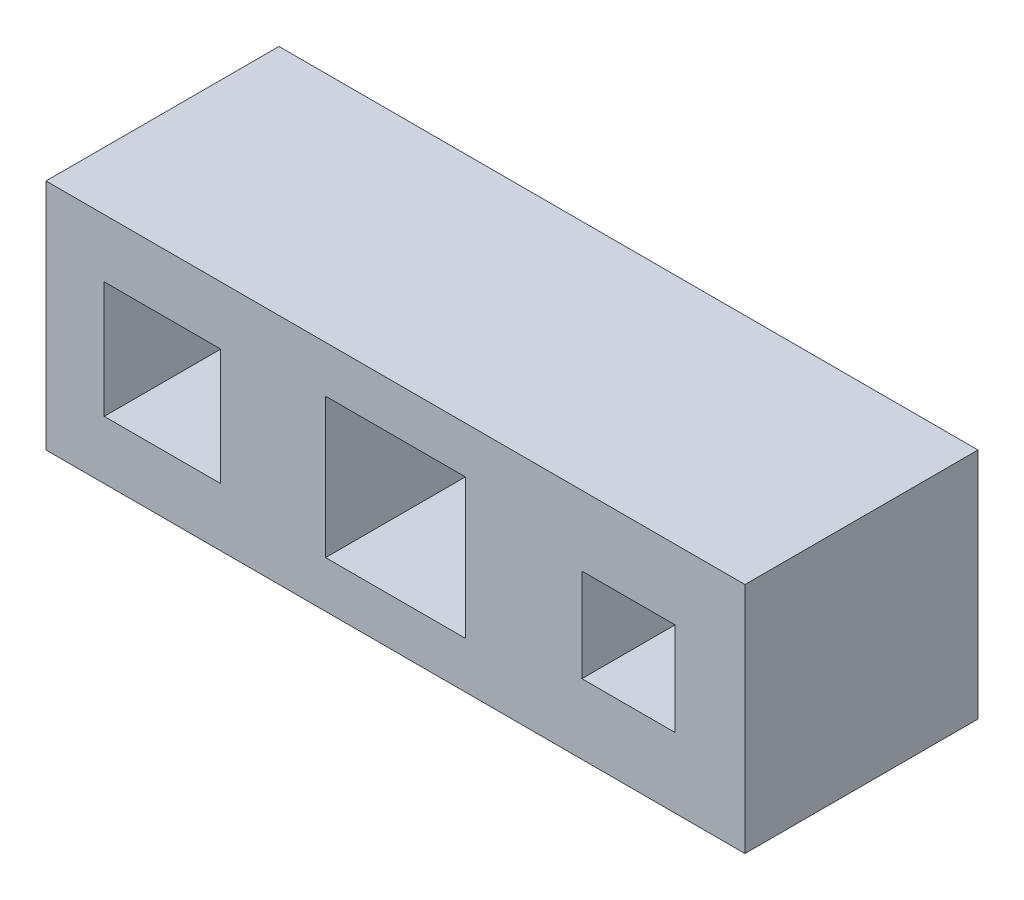
ISO-10303-21;
HEADER;
FILE_DESCRIPTION(('STEP AP214'),'2;1');
FILE_NAME('part.step','',(''),(''),'','','');
FILE_SCHEMA(('AUTOMOTIVE_DESIGN { 1 0 10303 214 1 1 1 1 }'));
ENDSEC;
DATA;
#1=APPLICATION_CONTEXT('core data for automotive mechanical design processes');
#2=APPLICATION_PROTOCOL_DEFINITION('international standard','automotive_design',2000,#1);
#3=PRODUCT_CONTEXT('',#1,'mechanical');
#4=PRODUCT('Part','Part','',(#3));
#5=PRODUCT_RELATED_PRODUCT_CATEGORY('part','',(#4));
#6=PRODUCT_DEFINITION_FORMATION('','',#4);
#7=PRODUCT_DEFINITION_CONTEXT('part definition',#1,'design');
#8=PRODUCT_DEFINITION('design','',#6,#7);
#9=PRODUCT_DEFINITION_SHAPE('','',#8);
#10=(LENGTH_UNIT() NAMED_UNIT(*) SI_UNIT(.MILLI.,.METRE.));
#11=(NAMED_UNIT(*) PLANE_ANGLE_UNIT() SI_UNIT($,.RADIAN.));
#12=(NAMED_UNIT(*) SI_UNIT($,.STERADIAN.) SOLID_ANGLE_UNIT());
#13=UNCERTAINTY_MEASURE_WITH_UNIT(LENGTH_MEASURE(1.E-05),#10,'distance_accuracy_value','');
#14=(GEOMETRIC_REPRESENTATION_CONTEXT(3) GLOBAL_UNCERTAINTY_ASSIGNED_CONTEXT((#13)) GLOBAL_UNIT_ASSIGNED_CONTEXT((#10,
#11,#12)) REPRESENTATION_CONTEXT('',''));
#15=CARTESIAN_POINT('',(0.,0.,0.));
#16=DIRECTION('',(0.,0.,1.));
#17=DIRECTION('',(1.,0.,0.));
#18=AXIS2_PLACEMENT_3D('',#15,#16,#17);
#19=CARTESIAN_POINT('',(0.,0.,5.));
#20=DIRECTION('',(0.,0.,-1.));
#21=DIRECTION('',(-1.,0.,0.));
#22=AXIS2_PLACEMENT_3D('',#19,#20,#21);
#23=PLANE('',#22);
#24=DIRECTION('',(0.,-1.,0.));
#25=VECTOR('',#24,1.);
#26=CARTESIAN_POINT('',(1.25,1.25,5.));
#27=LINE('',#26,#25);
#28=CARTESIAN_POINT('',(1.25,3.75,5.));
#29=VERTEX_POINT('',#28);
#30=CARTESIAN_POINT('',(1.25,1.25,5.));
#31=VERTEX_POINT('',#30);
#32=EDGE_CURVE('E182',#29,#31,#27,.T.);
#33=ORIENTED_EDGE('',*,*,#32,.F.);
#34=DIRECTION('',(-1.,0.,0.));
#35=VECTOR('',#34,1.);
#36=CARTESIAN_POINT('',(1.25,3.75,5.));
#37=LINE('',#36,#35);
#38=CARTESIAN_POINT('',(3.75,3.75,5.));
#39=VERTEX_POINT('',#38);
#40=EDGE_CURVE('E190',#39,#29,#37,.T.);
#41=ORIENTED_EDGE('',*,*,#40,.F.);
#42=DIRECTION('',(0.,1.,0.));
#43=VECTOR('',#42,1.);
#44=CARTESIAN_POINT('',(3.75,1.25,5.));
#45=LINE('',#44,#43);
#46=CARTESIAN_POINT('',(3.75,1.25,5.));
#47=VERTEX_POINT('',#46);
#48=EDGE_CURVE('E187',#47,#39,#45,.T.);
#49=ORIENTED_EDGE('',*,*,#48,.F.);
#50=DIRECTION('',(1.,0.,0.));
#51=VECTOR('',#50,1.);
#52=CARTESIAN_POINT('',(1.25,1.25,5.));
#53=LINE('',#52,#51);
#54=EDGE_CURVE('E184',#31,#47,#53,.T.);
#55=ORIENTED_EDGE('',*,*,#54,.F.);
#56=EDGE_LOOP('',(#33,#41,#49,#55));
#57=FACE_BOUND('',#56,.T.);
#58=DIRECTION('',(0.,-1.,0.));
#59=VECTOR('',#58,1.);
#60=CARTESIAN_POINT('',(0.,0.,5.));
#61=LINE('',#60,#59);
#62=CARTESIAN_POINT('',(0.,5.,5.));
#63=VERTEX_POINT('',#62);
#64=CARTESIAN_POINT('',(0.,0.,5.));
#65=VERTEX_POINT('',#64);
#66=EDGE_CURVE('E244',#63,#65,#61,.T.);
#67=ORIENTED_EDGE('',*,*,#66,.T.);
#68=DIRECTION('',(1.,0.,0.));
#69=VECTOR('',#68,1.);
#70=CARTESIAN_POINT('',(0.,0.,5.));
#71=LINE('',#70,#69);
#72=CARTESIAN_POINT('',(15.,0.,5.));
#73=VERTEX_POINT('',#72);
#74=EDGE_CURVE('E247',#65,#73,#71,.T.);
#75=ORIENTED_EDGE('',*,*,#74,.T.);
#76=DIRECTION('',(0.,1.,0.));
#77=VECTOR('',#76,1.);
#78=CARTESIAN_POINT('',(15.,5.,5.));
#79=LINE('',#78,#77);
#80=CARTESIAN_POINT('',(15.,5.,5.));
#81=VERTEX_POINT('',#80);
#82=EDGE_CURVE('E250',#73,#81,#79,.T.);
#83=ORIENTED_EDGE('',*,*,#82,.T.);
#84=DIRECTION('',(-1.,0.,0.));
#85=VECTOR('',#84,1.);
#86=CARTESIAN_POINT('',(5.,5.,5.));
#87=LINE('',#86,#85);
#88=EDGE_CURVE('E252',#81,#63,#87,.T.);
#89=ORIENTED_EDGE('',*,*,#88,.T.);
#90=EDGE_LOOP('',(#67,#75,#83,#89));
#91=FACE_BOUND('',#90,.T.);
#92=DIRECTION('',(0.,1.,0.));
#93=VECTOR('',#92,1.);
#94=CARTESIAN_POINT('',(13.5,3.5,5.));
#95=LINE('',#94,#93);
#96=CARTESIAN_POINT('',(13.5,1.5,5.));
#97=VERTEX_POINT('',#96);
#98=CARTESIAN_POINT('',(13.5,3.5,5.));
#99=VERTEX_POINT('',#98);
#100=EDGE_CURVE('E213',#97,#99,#95,.T.);
#101=ORIENTED_EDGE('',*,*,#100,.F.);
#102=DIRECTION('',(1.,0.,0.));
#103=VECTOR('',#102,1.);
#104=CARTESIAN_POINT('',(13.5,1.5,5.));
#105=LINE('',#104,#103);
#106=CARTESIAN_POINT('',(11.5,1.5,5.));
#107=VERTEX_POINT('',#106);
#108=EDGE_CURVE('E221',#107,#97,#105,.T.);
#109=ORIENTED_EDGE('',*,*,#108,.F.);
#110=DIRECTION('',(0.,-1.,0.));
#111=VECTOR('',#110,1.);
#112=CARTESIAN_POINT('',(11.5,3.5,5.));
#113=LINE('',#112,#111);
#114=CARTESIAN_POINT('',(11.5,3.5,5.));
#115=VERTEX_POINT('',#114);
#116=EDGE_CURVE('E218',#115,#107,#113,.T.);
#117=ORIENTED_EDGE('',*,*,#116,.F.);
#118=DIRECTION('',(-1.,0.,0.));
#119=VECTOR('',#118,1.);
#120=CARTESIAN_POINT('',(13.5,3.5,5.));
#121=LINE('',#120,#119);
#122=EDGE_CURVE('E215',#99,#115,#121,.T.);
#123=ORIENTED_EDGE('',*,*,#122,.F.);
#124=EDGE_LOOP('',(#101,#109,#117,#123));
#125=FACE_BOUND('',#124,.T.);
#126=DIRECTION('',(0.,1.,0.));
#127=VECTOR('',#126,1.);
#128=CARTESIAN_POINT('',(9.,4.,5.));
#129=LINE('',#128,#127);
#130=CARTESIAN_POINT('',(9.,0.999999999999998,5.));
#131=VERTEX_POINT('',#130);
#132=CARTESIAN_POINT('',(9.,4.,5.));
#133=VERTEX_POINT('',#132);
#134=EDGE_CURVE('E146',#131,#133,#129,.T.);
#135=ORIENTED_EDGE('',*,*,#134,.F.);
#136=DIRECTION('',(1.,0.,0.));
#137=VECTOR('',#136,1.);
#138=CARTESIAN_POINT('',(9.,0.999999999999998,5.));
#139=LINE('',#138,#137);
#140=CARTESIAN_POINT('',(6.,0.999999999999998,5.));
#141=VERTEX_POINT('',#140);
#142=EDGE_CURVE('E168',#141,#131,#139,.T.);
#143=ORIENTED_EDGE('',*,*,#142,.F.);
#144=DIRECTION('',(0.,-1.,0.));
#145=VECTOR('',#144,1.);
#146=CARTESIAN_POINT('',(6.,4.,5.));
#147=LINE('',#146,#145);
#148=CARTESIAN_POINT('',(6.,4.,5.));
#149=VERTEX_POINT('',#148);
#150=EDGE_CURVE('E166',#149,#141,#147,.T.);
#151=ORIENTED_EDGE('',*,*,#150,.F.);
#152=DIRECTION('',(-1.,0.,0.));
#153=VECTOR('',#152,1.);
#154=CARTESIAN_POINT('',(9.,4.,5.));
#155=LINE('',#154,#153);
#156=EDGE_CURVE('E154',#133,#149,#155,.T.);
#157=ORIENTED_EDGE('',*,*,#156,.F.);
#158=EDGE_LOOP('',(#135,#143,#151,#157));
#159=FACE_BOUND('',#158,.T.);
#160=ADVANCED_FACE('F33',(#57,#91,#125,#159),#23,.F.);
#161=CARTESIAN_POINT('',(0.,0.,0.));
#162=DIRECTION('',(0.,0.,-1.));
#163=DIRECTION('',(-1.,0.,0.));
#164=AXIS2_PLACEMENT_3D('',#161,#162,#163);
#165=PLANE('',#164);
#166=DIRECTION('',(0.,-1.,0.));
#167=VECTOR('',#166,1.);
#168=CARTESIAN_POINT('',(0.,0.,0.));
#169=LINE('',#168,#167);
#170=CARTESIAN_POINT('',(0.,5.,0.));
#171=VERTEX_POINT('',#170);
#172=CARTESIAN_POINT('',(0.,0.,0.));
#173=VERTEX_POINT('',#172);
#174=EDGE_CURVE('E243',#171,#173,#169,.T.);
#175=ORIENTED_EDGE('',*,*,#174,.F.);
#176=DIRECTION('',(-1.,0.,0.));
#177=VECTOR('',#176,1.);
#178=CARTESIAN_POINT('',(0.,5.,0.));
#179=LINE('',#178,#177);
#180=CARTESIAN_POINT('',(15.,5.,0.));
#181=VERTEX_POINT('',#180);
#182=EDGE_CURVE('E248',#181,#171,#179,.T.);
#183=ORIENTED_EDGE('',*,*,#182,.F.);
#184=DIRECTION('',(0.,1.,0.));
#185=VECTOR('',#184,1.);
#186=CARTESIAN_POINT('',(15.,5.,0.));
#187=LINE('',#186,#185);
#188=CARTESIAN_POINT('',(15.,0.,0.));
#189=VERTEX_POINT('',#188);
#190=EDGE_CURVE('E259',#189,#181,#187,.T.);
#191=ORIENTED_EDGE('',*,*,#190,.F.);
#192=DIRECTION('',(1.,0.,0.));
#193=VECTOR('',#192,1.);
#194=CARTESIAN_POINT('',(5.,0.,0.));
#195=LINE('',#194,#193);
#196=EDGE_CURVE('E257',#173,#189,#195,.T.);
#197=ORIENTED_EDGE('',*,*,#196,.F.);
#198=EDGE_LOOP('',(#175,#183,#191,#197));
#199=FACE_BOUND('',#198,.T.);
#200=DIRECTION('',(1.,0.,0.));
#201=VECTOR('',#200,1.);
#202=CARTESIAN_POINT('',(13.5,1.5,0.));
#203=LINE('',#202,#201);
#204=CARTESIAN_POINT('',(11.5,1.5,0.));
#205=VERTEX_POINT('',#204);
#206=CARTESIAN_POINT('',(13.5,1.5,0.));
#207=VERTEX_POINT('',#206);
#208=EDGE_CURVE('E216',#205,#207,#203,.T.);
#209=ORIENTED_EDGE('',*,*,#208,.T.);
#210=DIRECTION('',(0.,1.,0.));
#211=VECTOR('',#210,1.);
#212=CARTESIAN_POINT('',(13.5,3.5,0.));
#213=LINE('',#212,#211);
#214=CARTESIAN_POINT('',(13.5,3.5,0.));
#215=VERTEX_POINT('',#214);
#216=EDGE_CURVE('E212',#207,#215,#213,.T.);
#217=ORIENTED_EDGE('',*,*,#216,.T.);
#218=DIRECTION('',(-1.,0.,0.));
#219=VECTOR('',#218,1.);
#220=CARTESIAN_POINT('',(13.5,3.5,0.));
#221=LINE('',#220,#219);
#222=CARTESIAN_POINT('',(11.5,3.5,0.));
#223=VERTEX_POINT('',#222);
#224=EDGE_CURVE('E226',#215,#223,#221,.T.);
#225=ORIENTED_EDGE('',*,*,#224,.T.);
#226=DIRECTION('',(0.,-1.,0.));
#227=VECTOR('',#226,1.);
#228=CARTESIAN_POINT('',(11.5,3.5,0.));
#229=LINE('',#228,#227);
#230=EDGE_CURVE('E229',#223,#205,#229,.T.);
#231=ORIENTED_EDGE('',*,*,#230,.T.);
#232=EDGE_LOOP('',(#209,#217,#225,#231));
#233=FACE_BOUND('',#232,.T.);
#234=DIRECTION('',(-1.,0.,0.));
#235=VECTOR('',#234,1.);
#236=CARTESIAN_POINT('',(1.25,3.75,0.));
#237=LINE('',#236,#235);
#238=CARTESIAN_POINT('',(3.75,3.75,0.));
#239=VERTEX_POINT('',#238);
#240=CARTESIAN_POINT('',(1.25,3.75,0.));
#241=VERTEX_POINT('',#240);
#242=EDGE_CURVE('E185',#239,#241,#237,.T.);
#243=ORIENTED_EDGE('',*,*,#242,.T.);
#244=DIRECTION('',(0.,-1.,0.));
#245=VECTOR('',#244,1.);
#246=CARTESIAN_POINT('',(1.25,1.25,0.));
#247=LINE('',#246,#245);
#248=CARTESIAN_POINT('',(1.25,1.25,0.));
#249=VERTEX_POINT('',#248);
#250=EDGE_CURVE('E162',#241,#249,#247,.T.);
#251=ORIENTED_EDGE('',*,*,#250,.T.);
#252=DIRECTION('',(1.,0.,0.));
#253=VECTOR('',#252,1.);
#254=CARTESIAN_POINT('',(1.25,1.25,0.));
#255=LINE('',#254,#253);
#256=CARTESIAN_POINT('',(3.75,1.25,0.));
#257=VERTEX_POINT('',#256);
#258=EDGE_CURVE('E195',#249,#257,#255,.T.);
#259=ORIENTED_EDGE('',*,*,#258,.T.);
#260=DIRECTION('',(0.,1.,0.));
#261=VECTOR('',#260,1.);
#262=CARTESIAN_POINT('',(3.75,1.25,0.));
#263=LINE('',#262,#261);
#264=EDGE_CURVE('E198',#257,#239,#263,.T.);
#265=ORIENTED_EDGE('',*,*,#264,.T.);
#266=EDGE_LOOP('',(#243,#251,#259,#265));
#267=FACE_BOUND('',#266,.T.);
#268=DIRECTION('',(1.,0.,0.));
#269=VECTOR('',#268,1.);
#270=CARTESIAN_POINT('',(9.,0.999999999999998,0.));
#271=LINE('',#270,#269);
#272=CARTESIAN_POINT('',(6.,0.999999999999998,0.));
#273=VERTEX_POINT('',#272);
#274=CARTESIAN_POINT('',(9.,0.999999999999998,0.));
#275=VERTEX_POINT('',#274);
#276=EDGE_CURVE('E155',#273,#275,#271,.T.);
#277=ORIENTED_EDGE('',*,*,#276,.T.);
#278=DIRECTION('',(0.,1.,0.));
#279=VECTOR('',#278,1.);
#280=CARTESIAN_POINT('',(9.,4.,0.));
#281=LINE('',#280,#279);
#282=CARTESIAN_POINT('',(9.,4.,0.));
#283=VERTEX_POINT('',#282);
#284=EDGE_CURVE('E56',#275,#283,#281,.T.);
#285=ORIENTED_EDGE('',*,*,#284,.T.);
#286=DIRECTION('',(-1.,0.,0.));
#287=VECTOR('',#286,1.);
#288=CARTESIAN_POINT('',(9.,4.,0.));
#289=LINE('',#288,#287);
#290=CARTESIAN_POINT('',(6.,4.,0.));
#291=VERTEX_POINT('',#290);
#292=EDGE_CURVE('E161',#283,#291,#289,.T.);
#293=ORIENTED_EDGE('',*,*,#292,.T.);
#294=DIRECTION('',(0.,-1.,0.));
#295=VECTOR('',#294,1.);
#296=CARTESIAN_POINT('',(6.,4.,0.));
#297=LINE('',#296,#295);
#298=EDGE_CURVE('E174',#291,#273,#297,.T.);
#299=ORIENTED_EDGE('',*,*,#298,.T.);
#300=EDGE_LOOP('',(#277,#285,#293,#299));
#301=FACE_BOUND('',#300,.T.);
#302=ADVANCED_FACE('F277',(#199,#233,#267,#301),#165,.T.);
#303=CARTESIAN_POINT('',(0.,0.,5.));
#304=DIRECTION('',(1.,0.,0.));
#305=DIRECTION('',(0.,0.,-1.));
#306=AXIS2_PLACEMENT_3D('',#303,#304,#305);
#307=PLANE('',#306);
#308=ORIENTED_EDGE('',*,*,#174,.T.);
#309=DIRECTION('',(0.,0.,-1.));
#310=VECTOR('',#309,1.);
#311=CARTESIAN_POINT('',(0.,0.,5.));
#312=LINE('',#311,#310);
#313=EDGE_CURVE('E11',#65,#173,#312,.T.);
#314=ORIENTED_EDGE('',*,*,#313,.F.);
#315=ORIENTED_EDGE('',*,*,#66,.F.);
#316=DIRECTION('',(0.,0.,-1.));
#317=VECTOR('',#316,1.);
#318=CARTESIAN_POINT('',(0.,5.,5.));
#319=LINE('',#318,#317);
#320=EDGE_CURVE('E254',#63,#171,#319,.T.);
#321=ORIENTED_EDGE('',*,*,#320,.T.);
#322=EDGE_LOOP('',(#308,#314,#315,#321));
#323=FACE_BOUND('',#322,.T.);
#324=ADVANCED_FACE('F35',(#323),#307,.F.);
#325=CARTESIAN_POINT('',(5.,0.,5.));
#326=DIRECTION('',(0.,1.,0.));
#327=DIRECTION('',(0.,0.,1.));
#328=AXIS2_PLACEMENT_3D('',#325,#326,#327);
#329=PLANE('',#328);
#330=ORIENTED_EDGE('',*,*,#196,.T.);
#331=DIRECTION('',(0.,0.,-1.));
#332=VECTOR('',#331,1.);
#333=CARTESIAN_POINT('',(15.,0.,5.));
#334=LINE('',#333,#332);
#335=EDGE_CURVE('E41',#73,#189,#334,.T.);
#336=ORIENTED_EDGE('',*,*,#335,.F.);
#337=ORIENTED_EDGE('',*,*,#74,.F.);
#338=ORIENTED_EDGE('',*,*,#313,.T.);
#339=EDGE_LOOP('',(#330,#336,#337,#338));
#340=FACE_BOUND('',#339,.T.);
#341=ADVANCED_FACE('F288',(#340),#329,.F.);
#342=CARTESIAN_POINT('',(15.,5.,5.));
#343=DIRECTION('',(-1.,0.,0.));
#344=DIRECTION('',(0.,-1.,0.));
#345=AXIS2_PLACEMENT_3D('',#342,#343,#344);
#346=PLANE('',#345);
#347=ORIENTED_EDGE('',*,*,#190,.T.);
#348=DIRECTION('',(0.,0.,-1.));
#349=VECTOR('',#348,1.);
#350=CARTESIAN_POINT('',(15.,5.,5.));
#351=LINE('',#350,#349);
#352=EDGE_CURVE('E265',#81,#181,#351,.T.);
#353=ORIENTED_EDGE('',*,*,#352,.F.);
#354=ORIENTED_EDGE('',*,*,#82,.F.);
#355=ORIENTED_EDGE('',*,*,#335,.T.);
#356=EDGE_LOOP('',(#347,#353,#354,#355));
#357=FACE_BOUND('',#356,.T.);
#358=ADVANCED_FACE('F272',(#357),#346,.F.);
#359=CARTESIAN_POINT('',(0.,5.,5.));
#360=DIRECTION('',(0.,-1.,0.));
#361=DIRECTION('',(1.,0.,0.));
#362=AXIS2_PLACEMENT_3D('',#359,#360,#361);
#363=PLANE('',#362);
#364=ORIENTED_EDGE('',*,*,#182,.T.);
#365=ORIENTED_EDGE('',*,*,#320,.F.);
#366=ORIENTED_EDGE('',*,*,#88,.F.);
#367=ORIENTED_EDGE('',*,*,#352,.T.);
#368=EDGE_LOOP('',(#364,#365,#366,#367));
#369=FACE_BOUND('',#368,.T.);
#370=ADVANCED_FACE('F281',(#369),#363,.F.);
#371=CARTESIAN_POINT('',(13.5,3.5,5.));
#372=DIRECTION('',(-1.,0.,0.));
#373=DIRECTION('',(0.,0.,1.));
#374=AXIS2_PLACEMENT_3D('',#371,#372,#373);
#375=PLANE('',#374);
#376=ORIENTED_EDGE('',*,*,#216,.F.);
#377=DIRECTION('',(0.,0.,-1.));
#378=VECTOR('',#377,1.);
#379=CARTESIAN_POINT('',(13.5,1.5,5.));
#380=LINE('',#379,#378);
#381=EDGE_CURVE('E223',#97,#207,#380,.T.);
#382=ORIENTED_EDGE('',*,*,#381,.F.);
#383=ORIENTED_EDGE('',*,*,#100,.T.);
#384=DIRECTION('',(0.,0.,-1.));
#385=VECTOR('',#384,1.);
#386=CARTESIAN_POINT('',(13.5,3.5,5.));
#387=LINE('',#386,#385);
#388=EDGE_CURVE('E240',#99,#215,#387,.T.);
#389=ORIENTED_EDGE('',*,*,#388,.T.);
#390=EDGE_LOOP('',(#376,#382,#383,#389));
#391=FACE_BOUND('',#390,.T.);
#392=ADVANCED_FACE('F304',(#391),#375,.T.);
#393=CARTESIAN_POINT('',(13.5,3.5,5.));
#394=DIRECTION('',(0.,-1.,0.));
#395=DIRECTION('',(0.,0.,-1.));
#396=AXIS2_PLACEMENT_3D('',#393,#394,#395);
#397=PLANE('',#396);
#398=ORIENTED_EDGE('',*,*,#224,.F.);
#399=ORIENTED_EDGE('',*,*,#388,.F.);
#400=ORIENTED_EDGE('',*,*,#122,.T.);
#401=DIRECTION('',(0.,0.,-1.));
#402=VECTOR('',#401,1.);
#403=CARTESIAN_POINT('',(11.5,3.5,5.));
#404=LINE('',#403,#402);
#405=EDGE_CURVE('E238',#115,#223,#404,.T.);
#406=ORIENTED_EDGE('',*,*,#405,.T.);
#407=EDGE_LOOP('',(#398,#399,#400,#406));
#408=FACE_BOUND('',#407,.T.);
#409=ADVANCED_FACE('F311',(#408),#397,.T.);
#410=CARTESIAN_POINT('',(11.5,3.5,5.));
#411=DIRECTION('',(1.,0.,0.));
#412=DIRECTION('',(0.,0.,-1.));
#413=AXIS2_PLACEMENT_3D('',#410,#411,#412);
#414=PLANE('',#413);
#415=ORIENTED_EDGE('',*,*,#230,.F.);
#416=ORIENTED_EDGE('',*,*,#405,.F.);
#417=ORIENTED_EDGE('',*,*,#116,.T.);
#418=DIRECTION('',(0.,0.,-1.));
#419=VECTOR('',#418,1.);
#420=CARTESIAN_POINT('',(11.5,1.5,5.));
#421=LINE('',#420,#419);
#422=EDGE_CURVE('E236',#107,#205,#421,.T.);
#423=ORIENTED_EDGE('',*,*,#422,.T.);
#424=EDGE_LOOP('',(#415,#416,#417,#423));
#425=FACE_BOUND('',#424,.T.);
#426=ADVANCED_FACE('F316',(#425),#414,.T.);
#427=CARTESIAN_POINT('',(13.5,1.5,5.));
#428=DIRECTION('',(0.,1.,0.));
#429=DIRECTION('',(-1.,0.,0.));
#430=AXIS2_PLACEMENT_3D('',#427,#428,#429);
#431=PLANE('',#430);
#432=ORIENTED_EDGE('',*,*,#208,.F.);
#433=ORIENTED_EDGE('',*,*,#422,.F.);
#434=ORIENTED_EDGE('',*,*,#108,.T.);
#435=ORIENTED_EDGE('',*,*,#381,.T.);
#436=EDGE_LOOP('',(#432,#433,#434,#435));
#437=FACE_BOUND('',#436,.T.);
#438=ADVANCED_FACE('F323',(#437),#431,.T.);
#439=CARTESIAN_POINT('',(1.25,1.25,5.));
#440=DIRECTION('',(1.,0.,0.));
#441=DIRECTION('',(0.,0.,-1.));
#442=AXIS2_PLACEMENT_3D('',#439,#440,#441);
#443=PLANE('',#442);
#444=ORIENTED_EDGE('',*,*,#250,.F.);
#445=DIRECTION('',(0.,0.,-1.));
#446=VECTOR('',#445,1.);
#447=CARTESIAN_POINT('',(1.25,3.75,5.));
#448=LINE('',#447,#446);
#449=EDGE_CURVE('E192',#29,#241,#448,.T.);
#450=ORIENTED_EDGE('',*,*,#449,.F.);
#451=ORIENTED_EDGE('',*,*,#32,.T.);
#452=DIRECTION('',(0.,0.,-1.));
#453=VECTOR('',#452,1.);
#454=CARTESIAN_POINT('',(1.25,1.25,5.));
#455=LINE('',#454,#453);
#456=EDGE_CURVE('E209',#31,#249,#455,.T.);
#457=ORIENTED_EDGE('',*,*,#456,.T.);
#458=EDGE_LOOP('',(#444,#450,#451,#457));
#459=FACE_BOUND('',#458,.T.);
#460=ADVANCED_FACE('F336',(#459),#443,.T.);
#461=CARTESIAN_POINT('',(1.25,1.25,5.));
#462=DIRECTION('',(0.,1.,0.));
#463=DIRECTION('',(0.,0.,1.));
#464=AXIS2_PLACEMENT_3D('',#461,#462,#463);
#465=PLANE('',#464);
#466=ORIENTED_EDGE('',*,*,#258,.F.);
#467=ORIENTED_EDGE('',*,*,#456,.F.);
#468=ORIENTED_EDGE('',*,*,#54,.T.);
#469=DIRECTION('',(0.,0.,-1.));
#470=VECTOR('',#469,1.);
#471=CARTESIAN_POINT('',(3.75,1.25,5.));
#472=LINE('',#471,#470);
#473=EDGE_CURVE('E207',#47,#257,#472,.T.);
#474=ORIENTED_EDGE('',*,*,#473,.T.);
#475=EDGE_LOOP('',(#466,#467,#468,#474));
#476=FACE_BOUND('',#475,.T.);
#477=ADVANCED_FACE('F341',(#476),#465,.T.);
#478=CARTESIAN_POINT('',(3.75,1.25,5.));
#479=DIRECTION('',(-1.,0.,0.));
#480=DIRECTION('',(0.,0.,1.));
#481=AXIS2_PLACEMENT_3D('',#478,#479,#480);
#482=PLANE('',#481);
#483=ORIENTED_EDGE('',*,*,#264,.F.);
#484=ORIENTED_EDGE('',*,*,#473,.F.);
#485=ORIENTED_EDGE('',*,*,#48,.T.);
#486=DIRECTION('',(0.,0.,-1.));
#487=VECTOR('',#486,1.);
#488=CARTESIAN_POINT('',(3.75,3.75,5.));
#489=LINE('',#488,#487);
#490=EDGE_CURVE('E205',#39,#239,#489,.T.);
#491=ORIENTED_EDGE('',*,*,#490,.T.);
#492=EDGE_LOOP('',(#483,#484,#485,#491));
#493=FACE_BOUND('',#492,.T.);
#494=ADVANCED_FACE('F345',(#493),#482,.T.);
#495=CARTESIAN_POINT('',(1.25,3.75,5.));
#496=DIRECTION('',(0.,-1.,0.));
#497=DIRECTION('',(0.,0.,-1.));
#498=AXIS2_PLACEMENT_3D('',#495,#496,#497);
#499=PLANE('',#498);
#500=ORIENTED_EDGE('',*,*,#242,.F.);
#501=ORIENTED_EDGE('',*,*,#490,.F.);
#502=ORIENTED_EDGE('',*,*,#40,.T.);
#503=ORIENTED_EDGE('',*,*,#449,.T.);
#504=EDGE_LOOP('',(#500,#501,#502,#503));
#505=FACE_BOUND('',#504,.T.);
#506=ADVANCED_FACE('F349',(#505),#499,.T.);
#507=CARTESIAN_POINT('',(9.,4.,5.));
#508=DIRECTION('',(-1.,0.,0.));
#509=DIRECTION('',(0.,-1.,0.));
#510=AXIS2_PLACEMENT_3D('',#507,#508,#509);
#511=PLANE('',#510);
#512=ORIENTED_EDGE('',*,*,#284,.F.);
#513=DIRECTION('',(0.,0.,-1.));
#514=VECTOR('',#513,1.);
#515=CARTESIAN_POINT('',(9.,0.999999999999998,5.));
#516=LINE('',#515,#514);
#517=EDGE_CURVE('E150',#131,#275,#516,.T.);
#518=ORIENTED_EDGE('',*,*,#517,.F.);
#519=ORIENTED_EDGE('',*,*,#134,.T.);
#520=DIRECTION('',(0.,0.,-1.));
#521=VECTOR('',#520,1.);
#522=CARTESIAN_POINT('',(9.,4.,5.));
#523=LINE('',#522,#521);
#524=EDGE_CURVE('E149',#133,#283,#523,.T.);
#525=ORIENTED_EDGE('',*,*,#524,.T.);
#526=EDGE_LOOP('',(#512,#518,#519,#525));
#527=FACE_BOUND('',#526,.T.);
#528=ADVANCED_FACE('F148',(#527),#511,.T.);
#529=CARTESIAN_POINT('',(9.,4.,5.));
#530=DIRECTION('',(0.,-1.,0.));
#531=DIRECTION('',(0.,0.,-1.));
#532=AXIS2_PLACEMENT_3D('',#529,#530,#531);
#533=PLANE('',#532);
#534=ORIENTED_EDGE('',*,*,#292,.F.);
#535=ORIENTED_EDGE('',*,*,#524,.F.);
#536=ORIENTED_EDGE('',*,*,#156,.T.);
#537=DIRECTION('',(0.,0.,-1.));
#538=VECTOR('',#537,1.);
#539=CARTESIAN_POINT('',(6.,4.,5.));
#540=LINE('',#539,#538);
#541=EDGE_CURVE('E163',#149,#291,#540,.T.);
#542=ORIENTED_EDGE('',*,*,#541,.T.);
#543=EDGE_LOOP('',(#534,#535,#536,#542));
#544=FACE_BOUND('',#543,.T.);
#545=ADVANCED_FACE('F158',(#544),#533,.T.);
#546=CARTESIAN_POINT('',(6.,4.,5.));
#547=DIRECTION('',(1.,0.,0.));
#548=DIRECTION('',(0.,0.,-1.));
#549=AXIS2_PLACEMENT_3D('',#546,#547,#548);
#550=PLANE('',#549);
#551=ORIENTED_EDGE('',*,*,#298,.F.);
#552=ORIENTED_EDGE('',*,*,#541,.F.);
#553=ORIENTED_EDGE('',*,*,#150,.T.);
#554=DIRECTION('',(0.,0.,-1.));
#555=VECTOR('',#554,1.);
#556=CARTESIAN_POINT('',(6.,0.999999999999998,5.));
#557=LINE('',#556,#555);
#558=EDGE_CURVE('E48',#141,#273,#557,.T.);
#559=ORIENTED_EDGE('',*,*,#558,.T.);
#560=EDGE_LOOP('',(#551,#552,#553,#559));
#561=FACE_BOUND('',#560,.T.);
#562=ADVANCED_FACE('F358',(#561),#550,.T.);
#563=CARTESIAN_POINT('',(9.,0.999999999999998,5.));
#564=DIRECTION('',(0.,1.,0.));
#565=DIRECTION('',(-1.,0.,0.));
#566=AXIS2_PLACEMENT_3D('',#563,#564,#565);
#567=PLANE('',#566);
#568=ORIENTED_EDGE('',*,*,#276,.F.);
#569=ORIENTED_EDGE('',*,*,#558,.F.);
#570=ORIENTED_EDGE('',*,*,#142,.T.);
#571=ORIENTED_EDGE('',*,*,#517,.T.);
#572=EDGE_LOOP('',(#568,#569,#570,#571));
#573=FACE_BOUND('',#572,.T.);
#574=ADVANCED_FACE('F361',(#573),#567,.T.);
#575=CLOSED_SHELL('',(#160,#302,#324,#341,#358,#370,#392,#409,#426,#438,#460,#477,#494,#506,
#528,#545,#562,#574));
#576=MANIFOLD_SOLID_BREP('B2',#575);
#577=ADVANCED_BREP_SHAPE_REPRESENTATION('',(#18,#576),#14);
#578=SHAPE_DEFINITION_REPRESENTATION(#9,#577);
ENDSEC;
END-ISO-10303-21;
